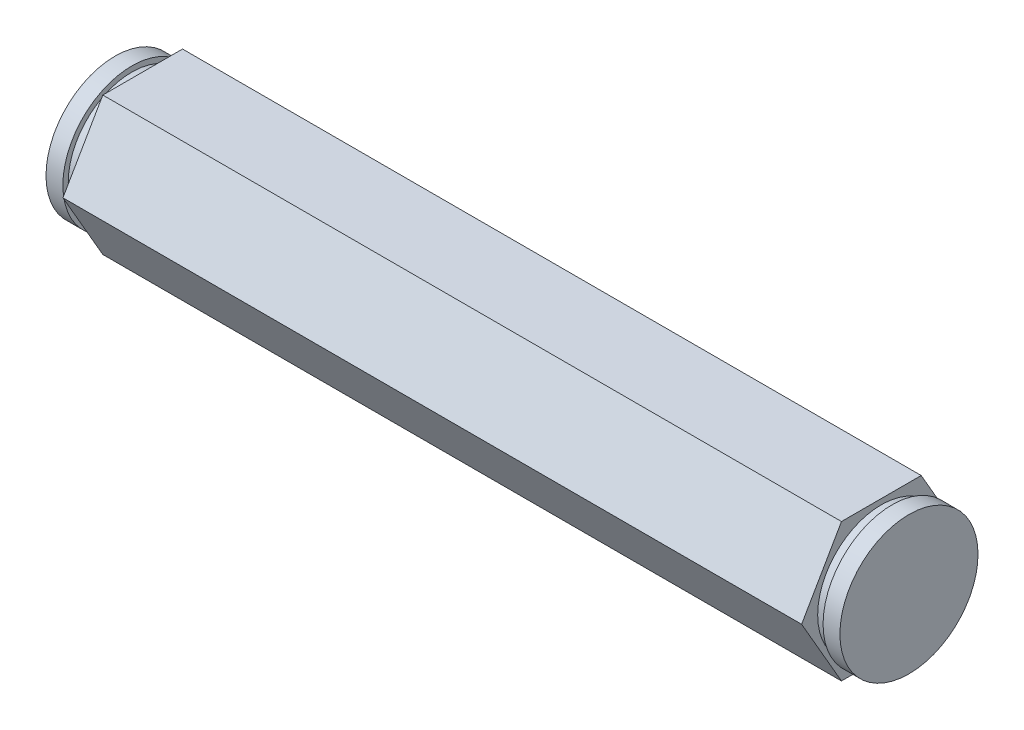
ISO-10303-21;
HEADER;
FILE_DESCRIPTION(('STEP AP214'),'2;1');
FILE_NAME('part.step','',(''),(''),'','','');
FILE_SCHEMA(('AUTOMOTIVE_DESIGN { 1 0 10303 214 1 1 1 1 }'));
ENDSEC;
DATA;
#1=APPLICATION_CONTEXT('core data for automotive mechanical design processes');
#2=APPLICATION_PROTOCOL_DEFINITION('international standard','automotive_design',2000,#1);
#3=PRODUCT_CONTEXT('',#1,'mechanical');
#4=PRODUCT('Part','Part','',(#3));
#5=PRODUCT_RELATED_PRODUCT_CATEGORY('part','',(#4));
#6=PRODUCT_DEFINITION_FORMATION('','',#4);
#7=PRODUCT_DEFINITION_CONTEXT('part definition',#1,'design');
#8=PRODUCT_DEFINITION('design','',#6,#7);
#9=PRODUCT_DEFINITION_SHAPE('','',#8);
#10=(LENGTH_UNIT() NAMED_UNIT(*) SI_UNIT(.MILLI.,.METRE.));
#11=(NAMED_UNIT(*) PLANE_ANGLE_UNIT() SI_UNIT($,.RADIAN.));
#12=(NAMED_UNIT(*) SI_UNIT($,.STERADIAN.) SOLID_ANGLE_UNIT());
#13=UNCERTAINTY_MEASURE_WITH_UNIT(LENGTH_MEASURE(1.E-05),#10,'distance_accuracy_value','');
#14=(GEOMETRIC_REPRESENTATION_CONTEXT(3) GLOBAL_UNCERTAINTY_ASSIGNED_CONTEXT((#13)) GLOBAL_UNIT_ASSIGNED_CONTEXT((#10,
#11,#12)) REPRESENTATION_CONTEXT('',''));
#15=CARTESIAN_POINT('',(0.,0.,0.));
#16=DIRECTION('',(0.,0.,1.));
#17=DIRECTION('',(1.,0.,0.));
#18=AXIS2_PLACEMENT_3D('',#15,#16,#17);
#19=CARTESIAN_POINT('',(36.50750001,-6.34999999999993,-3.66617420935418));
#20=DIRECTION('',(0.,0.499999999999995,0.866025403784441));
#21=DIRECTION('',(0.,-0.866025403784441,0.499999999999995));
#22=AXIS2_PLACEMENT_3D('',#19,#20,#21);
#23=PLANE('',#22);
#24=DIRECTION('',(-1.,0.,0.));
#25=VECTOR('',#24,1.);
#26=CARTESIAN_POINT('',(36.50750001,-6.34999999999993,-3.66617420935418));
#27=LINE('',#26,#25);
#28=CARTESIAN_POINT('',(33.96750001,-6.34999999999993,-3.66617420935418));
#29=VERTEX_POINT('',#28);
#30=CARTESIAN_POINT('',(-33.96750001,-6.34999999999993,-3.66617420935418));
#31=VERTEX_POINT('',#30);
#32=EDGE_CURVE('E114',#29,#31,#27,.T.);
#33=ORIENTED_EDGE('',*,*,#32,.T.);
#34=DIRECTION('',(0.,0.866025403784441,-0.499999999999995));
#35=VECTOR('',#34,1.);
#36=CARTESIAN_POINT('',(-33.96750001,-6.34999999999993,-3.66617420935418));
#37=LINE('',#36,#35);
#38=CARTESIAN_POINT('',(-33.96750001,0.,-7.33234841870821));
#39=VERTEX_POINT('',#38);
#40=EDGE_CURVE('E58',#31,#39,#37,.T.);
#41=ORIENTED_EDGE('',*,*,#40,.T.);
#42=DIRECTION('',(-1.,0.,0.));
#43=VECTOR('',#42,1.);
#44=CARTESIAN_POINT('',(36.50750001,0.,-7.33234841870821));
#45=LINE('',#44,#43);
#46=CARTESIAN_POINT('',(33.96750001,0.,-7.33234841870821));
#47=VERTEX_POINT('',#46);
#48=EDGE_CURVE('E131',#47,#39,#45,.T.);
#49=ORIENTED_EDGE('',*,*,#48,.F.);
#50=DIRECTION('',(0.,-0.866025403784441,0.499999999999995));
#51=VECTOR('',#50,1.);
#52=CARTESIAN_POINT('',(33.96750001,-6.34999999999993,-3.66617420935418));
#53=LINE('',#52,#51);
#54=EDGE_CURVE('E120',#47,#29,#53,.T.);
#55=ORIENTED_EDGE('',*,*,#54,.T.);
#56=EDGE_LOOP('',(#33,#41,#49,#55));
#57=FACE_BOUND('',#56,.T.);
#58=ADVANCED_FACE('F43',(#57),#23,.F.);
#59=CARTESIAN_POINT('',(36.50750001,0.,-7.33234841870821));
#60=DIRECTION('',(0.,-0.500000000000001,0.866025403784438));
#61=DIRECTION('',(0.,-0.866025403784438,-0.500000000000001));
#62=AXIS2_PLACEMENT_3D('',#59,#60,#61);
#63=PLANE('',#62);
#64=ORIENTED_EDGE('',*,*,#48,.T.);
#65=DIRECTION('',(0.,0.866025403784438,0.500000000000001));
#66=VECTOR('',#65,1.);
#67=CARTESIAN_POINT('',(-33.96750001,0.,-7.33234841870821));
#68=LINE('',#67,#66);
#69=CARTESIAN_POINT('',(-33.96750001,6.34999999999998,-3.66617420935409));
#70=VERTEX_POINT('',#69);
#71=EDGE_CURVE('E171',#39,#70,#68,.T.);
#72=ORIENTED_EDGE('',*,*,#71,.T.);
#73=DIRECTION('',(-1.,0.,0.));
#74=VECTOR('',#73,1.);
#75=CARTESIAN_POINT('',(36.50750001,6.34999999999998,-3.66617420935409));
#76=LINE('',#75,#74);
#77=CARTESIAN_POINT('',(33.96750001,6.34999999999998,-3.66617420935409));
#78=VERTEX_POINT('',#77);
#79=EDGE_CURVE('E127',#78,#70,#76,.T.);
#80=ORIENTED_EDGE('',*,*,#79,.F.);
#81=DIRECTION('',(0.,-0.866025403784438,-0.500000000000001));
#82=VECTOR('',#81,1.);
#83=CARTESIAN_POINT('',(33.96750001,0.,-7.33234841870821));
#84=LINE('',#83,#82);
#85=EDGE_CURVE('E199',#78,#47,#84,.T.);
#86=ORIENTED_EDGE('',*,*,#85,.T.);
#87=EDGE_LOOP('',(#64,#72,#80,#86));
#88=FACE_BOUND('',#87,.T.);
#89=ADVANCED_FACE('F209',(#88),#63,.F.);
#90=CARTESIAN_POINT('',(36.50750001,6.34999999999998,-3.66617420935409));
#91=DIRECTION('',(0.,-1.,0.));
#92=DIRECTION('',(0.,0.,-1.));
#93=AXIS2_PLACEMENT_3D('',#90,#91,#92);
#94=PLANE('',#93);
#95=ORIENTED_EDGE('',*,*,#79,.T.);
#96=DIRECTION('',(0.,0.,1.));
#97=VECTOR('',#96,1.);
#98=CARTESIAN_POINT('',(-33.96750001,6.34999999999998,-3.66617420935409));
#99=LINE('',#98,#97);
#100=CARTESIAN_POINT('',(-33.96750001,6.34999999999995,3.66617420935414));
#101=VERTEX_POINT('',#100);
#102=EDGE_CURVE('E167',#70,#101,#99,.T.);
#103=ORIENTED_EDGE('',*,*,#102,.T.);
#104=DIRECTION('',(-1.,0.,0.));
#105=VECTOR('',#104,1.);
#106=CARTESIAN_POINT('',(36.50750001,6.34999999999995,3.66617420935414));
#107=LINE('',#106,#105);
#108=CARTESIAN_POINT('',(33.96750001,6.34999999999995,3.66617420935414));
#109=VERTEX_POINT('',#108);
#110=EDGE_CURVE('E118',#109,#101,#107,.T.);
#111=ORIENTED_EDGE('',*,*,#110,.F.);
#112=DIRECTION('',(0.,0.,-1.));
#113=VECTOR('',#112,1.);
#114=CARTESIAN_POINT('',(33.96750001,6.34999999999998,-3.66617420935409));
#115=LINE('',#114,#113);
#116=EDGE_CURVE('E195',#109,#78,#115,.T.);
#117=ORIENTED_EDGE('',*,*,#116,.T.);
#118=EDGE_LOOP('',(#95,#103,#111,#117));
#119=FACE_BOUND('',#118,.T.);
#120=ADVANCED_FACE('F211',(#119),#94,.F.);
#121=CARTESIAN_POINT('',(36.50750001,6.34999999999995,3.66617420935414));
#122=DIRECTION('',(0.,-0.499999999999995,-0.866025403784442));
#123=DIRECTION('',(0.,0.866025403784442,-0.499999999999995));
#124=AXIS2_PLACEMENT_3D('',#121,#122,#123);
#125=PLANE('',#124);
#126=ORIENTED_EDGE('',*,*,#110,.T.);
#127=DIRECTION('',(0.,-0.866025403784442,0.499999999999995));
#128=VECTOR('',#127,1.);
#129=CARTESIAN_POINT('',(-33.96750001,6.34999999999995,3.66617420935414));
#130=LINE('',#129,#128);
#131=CARTESIAN_POINT('',(-33.96750001,0.,7.33234841870821));
#132=VERTEX_POINT('',#131);
#133=EDGE_CURVE('E108',#101,#132,#130,.T.);
#134=ORIENTED_EDGE('',*,*,#133,.T.);
#135=DIRECTION('',(-1.,0.,0.));
#136=VECTOR('',#135,1.);
#137=CARTESIAN_POINT('',(36.50750001,0.,7.33234841870821));
#138=LINE('',#137,#136);
#139=CARTESIAN_POINT('',(33.96750001,0.,7.33234841870821));
#140=VERTEX_POINT('',#139);
#141=EDGE_CURVE('E106',#140,#132,#138,.T.);
#142=ORIENTED_EDGE('',*,*,#141,.F.);
#143=DIRECTION('',(0.,0.866025403784442,-0.499999999999995));
#144=VECTOR('',#143,1.);
#145=CARTESIAN_POINT('',(33.96750001,6.34999999999995,3.66617420935414));
#146=LINE('',#145,#144);
#147=EDGE_CURVE('E191',#140,#109,#146,.T.);
#148=ORIENTED_EDGE('',*,*,#147,.T.);
#149=EDGE_LOOP('',(#126,#134,#142,#148));
#150=FACE_BOUND('',#149,.T.);
#151=ADVANCED_FACE('F214',(#150),#125,.F.);
#152=CARTESIAN_POINT('',(36.50750001,0.,7.33234841870821));
#153=DIRECTION('',(0.,0.500000000000007,-0.866025403784435));
#154=DIRECTION('',(0.,0.866025403784434,0.500000000000007));
#155=AXIS2_PLACEMENT_3D('',#152,#153,#154);
#156=PLANE('',#155);
#157=ORIENTED_EDGE('',*,*,#141,.T.);
#158=DIRECTION('',(0.,-0.866025403784434,-0.500000000000007));
#159=VECTOR('',#158,1.);
#160=CARTESIAN_POINT('',(-33.96750001,0.,7.33234841870821));
#161=LINE('',#160,#159);
#162=CARTESIAN_POINT('',(-33.96750001,-6.35,3.66617420935405));
#163=VERTEX_POINT('',#162);
#164=EDGE_CURVE('E94',#132,#163,#161,.T.);
#165=ORIENTED_EDGE('',*,*,#164,.T.);
#166=DIRECTION('',(-1.,0.,0.));
#167=VECTOR('',#166,1.);
#168=CARTESIAN_POINT('',(36.50750001,-6.35,3.66617420935405));
#169=LINE('',#168,#167);
#170=CARTESIAN_POINT('',(33.96750001,-6.35,3.66617420935405));
#171=VERTEX_POINT('',#170);
#172=EDGE_CURVE('E104',#171,#163,#169,.T.);
#173=ORIENTED_EDGE('',*,*,#172,.F.);
#174=DIRECTION('',(0.,0.866025403784434,0.500000000000007));
#175=VECTOR('',#174,1.);
#176=CARTESIAN_POINT('',(33.96750001,0.,7.33234841870821));
#177=LINE('',#176,#175);
#178=EDGE_CURVE('E65',#171,#140,#177,.T.);
#179=ORIENTED_EDGE('',*,*,#178,.T.);
#180=EDGE_LOOP('',(#157,#165,#173,#179));
#181=FACE_BOUND('',#180,.T.);
#182=ADVANCED_FACE('F103',(#181),#156,.F.);
#183=CARTESIAN_POINT('',(36.50750001,-6.35,3.66617420935405));
#184=DIRECTION('',(0.,1.,0.));
#185=DIRECTION('',(0.,0.,1.));
#186=AXIS2_PLACEMENT_3D('',#183,#184,#185);
#187=PLANE('',#186);
#188=ORIENTED_EDGE('',*,*,#172,.T.);
#189=DIRECTION('',(0.,0.,-1.));
#190=VECTOR('',#189,1.);
#191=CARTESIAN_POINT('',(-33.96750001,-6.35,3.66617420935405));
#192=LINE('',#191,#190);
#193=EDGE_CURVE('E11',#163,#31,#192,.T.);
#194=ORIENTED_EDGE('',*,*,#193,.T.);
#195=ORIENTED_EDGE('',*,*,#32,.F.);
#196=DIRECTION('',(0.,0.,1.));
#197=VECTOR('',#196,1.);
#198=CARTESIAN_POINT('',(33.96750001,-6.35,3.66617420935405));
#199=LINE('',#198,#197);
#200=EDGE_CURVE('E112',#29,#171,#199,.T.);
#201=ORIENTED_EDGE('',*,*,#200,.T.);
#202=EDGE_LOOP('',(#188,#194,#195,#201));
#203=FACE_BOUND('',#202,.T.);
#204=ADVANCED_FACE('F111',(#203),#187,.F.);
#205=CARTESIAN_POINT('',(33.96750001,0.,8.89));
#206=DIRECTION('',(-1.,0.,0.));
#207=DIRECTION('',(0.,0.,1.));
#208=AXIS2_PLACEMENT_3D('',#205,#206,#207);
#209=PLANE('',#208);
#210=CARTESIAN_POINT('',(33.96750001,0.,0.));
#211=DIRECTION('',(-1.,0.,0.));
#212=DIRECTION('',(0.,0.,1.));
#213=AXIS2_PLACEMENT_3D('',#210,#211,#212);
#214=CIRCLE('',#213,5.8547);
#215=CARTESIAN_POINT('',(33.96750001,0.,5.8547));
#216=VERTEX_POINT('',#215);
#217=EDGE_CURVE('E185',#216,#216,#214,.T.);
#218=ORIENTED_EDGE('',*,*,#217,.T.);
#219=EDGE_LOOP('',(#218));
#220=FACE_BOUND('',#219,.T.);
#221=ORIENTED_EDGE('',*,*,#85,.F.);
#222=ORIENTED_EDGE('',*,*,#116,.F.);
#223=ORIENTED_EDGE('',*,*,#147,.F.);
#224=ORIENTED_EDGE('',*,*,#178,.F.);
#225=ORIENTED_EDGE('',*,*,#200,.F.);
#226=ORIENTED_EDGE('',*,*,#54,.F.);
#227=EDGE_LOOP('',(#221,#222,#223,#224,#225,#226));
#228=FACE_BOUND('',#227,.T.);
#229=ADVANCED_FACE('F206',(#220,#228),#209,.F.);
#230=CARTESIAN_POINT('',(0.,0.,0.));
#231=DIRECTION('',(-1.,0.,0.));
#232=DIRECTION('',(0.,0.,1.));
#233=AXIS2_PLACEMENT_3D('',#230,#231,#232);
#234=CYLINDRICAL_SURFACE('',#233,6.35);
#235=CARTESIAN_POINT('',(36.50750001,0.,0.));
#236=DIRECTION('',(1.,0.,0.));
#237=DIRECTION('',(0.,0.,-1.));
#238=AXIS2_PLACEMENT_3D('',#235,#236,#237);
#239=CIRCLE('',#238,6.35);
#240=CARTESIAN_POINT('',(36.50750001,0.,-6.35));
#241=VERTEX_POINT('',#240);
#242=EDGE_CURVE('E135',#241,#241,#239,.F.);
#243=ORIENTED_EDGE('',*,*,#242,.T.);
#244=EDGE_LOOP('',(#243));
#245=FACE_BOUND('',#244,.T.);
#246=CARTESIAN_POINT('',(34.95810001,0.,0.));
#247=DIRECTION('',(-1.,0.,0.));
#248=DIRECTION('',(0.,0.,1.));
#249=AXIS2_PLACEMENT_3D('',#246,#247,#248);
#250=CIRCLE('',#249,6.35);
#251=CARTESIAN_POINT('',(34.95810001,0.,6.35));
#252=VERTEX_POINT('',#251);
#253=EDGE_CURVE('E177',#252,#252,#250,.T.);
#254=ORIENTED_EDGE('',*,*,#253,.F.);
#255=EDGE_LOOP('',(#254));
#256=FACE_BOUND('',#255,.T.);
#257=ADVANCED_FACE('F331',(#245,#256),#234,.T.);
#258=CARTESIAN_POINT('',(0.,0.,0.));
#259=DIRECTION('',(-1.,0.,0.));
#260=DIRECTION('',(0.,0.,1.));
#261=AXIS2_PLACEMENT_3D('',#258,#259,#260);
#262=CYLINDRICAL_SURFACE('',#261,5.8547);
#263=ORIENTED_EDGE('',*,*,#217,.F.);
#264=EDGE_LOOP('',(#263));
#265=FACE_BOUND('',#264,.T.);
#266=CARTESIAN_POINT('',(34.95810001,0.,0.));
#267=DIRECTION('',(-1.,0.,0.));
#268=DIRECTION('',(0.,0.,1.));
#269=AXIS2_PLACEMENT_3D('',#266,#267,#268);
#270=CIRCLE('',#269,5.8547);
#271=CARTESIAN_POINT('',(34.95810001,0.,5.8547));
#272=VERTEX_POINT('',#271);
#273=EDGE_CURVE('E181',#272,#272,#270,.T.);
#274=ORIENTED_EDGE('',*,*,#273,.T.);
#275=EDGE_LOOP('',(#274));
#276=FACE_BOUND('',#275,.T.);
#277=ADVANCED_FACE('F319',(#265,#276),#262,.T.);
#278=CARTESIAN_POINT('',(34.95810001,0.,5.8547));
#279=DIRECTION('',(1.,0.,0.));
#280=DIRECTION('',(0.,0.,-1.));
#281=AXIS2_PLACEMENT_3D('',#278,#279,#280);
#282=PLANE('',#281);
#283=ORIENTED_EDGE('',*,*,#273,.F.);
#284=EDGE_LOOP('',(#283));
#285=FACE_BOUND('',#284,.T.);
#286=ORIENTED_EDGE('',*,*,#253,.T.);
#287=EDGE_LOOP('',(#286));
#288=FACE_BOUND('',#287,.T.);
#289=ADVANCED_FACE('F313',(#285,#288),#282,.F.);
#290=CARTESIAN_POINT('',(36.50750001,0.,0.));
#291=DIRECTION('',(1.,0.,0.));
#292=DIRECTION('',(0.,0.,-1.));
#293=AXIS2_PLACEMENT_3D('',#290,#291,#292);
#294=PLANE('',#293);
#295=ORIENTED_EDGE('',*,*,#242,.F.);
#296=EDGE_LOOP('',(#295));
#297=FACE_BOUND('',#296,.T.);
#298=ADVANCED_FACE('F266',(#297),#294,.T.);
#299=CARTESIAN_POINT('',(-33.96750001,0.,8.89));
#300=DIRECTION('',(1.,0.,0.));
#301=DIRECTION('',(0.,0.,1.));
#302=AXIS2_PLACEMENT_3D('',#299,#300,#301);
#303=PLANE('',#302);
#304=CARTESIAN_POINT('',(-33.96750001,0.,0.));
#305=DIRECTION('',(-1.,0.,0.));
#306=DIRECTION('',(0.,0.,1.));
#307=AXIS2_PLACEMENT_3D('',#304,#305,#306);
#308=CIRCLE('',#307,5.8547);
#309=CARTESIAN_POINT('',(-33.96750001,0.,5.8547));
#310=VERTEX_POINT('',#309);
#311=EDGE_CURVE('E109',#310,#310,#308,.T.);
#312=ORIENTED_EDGE('',*,*,#311,.F.);
#313=EDGE_LOOP('',(#312));
#314=FACE_BOUND('',#313,.T.);
#315=ORIENTED_EDGE('',*,*,#193,.F.);
#316=ORIENTED_EDGE('',*,*,#164,.F.);
#317=ORIENTED_EDGE('',*,*,#133,.F.);
#318=ORIENTED_EDGE('',*,*,#102,.F.);
#319=ORIENTED_EDGE('',*,*,#71,.F.);
#320=ORIENTED_EDGE('',*,*,#40,.F.);
#321=EDGE_LOOP('',(#315,#316,#317,#318,#319,#320));
#322=FACE_BOUND('',#321,.T.);
#323=ADVANCED_FACE('F93',(#314,#322),#303,.F.);
#324=CARTESIAN_POINT('',(0.,0.,0.));
#325=DIRECTION('',(1.,0.,0.));
#326=DIRECTION('',(0.,0.,1.));
#327=AXIS2_PLACEMENT_3D('',#324,#325,#326);
#328=CYLINDRICAL_SURFACE('',#327,6.35);
#329=CARTESIAN_POINT('',(-36.50750001,0.,0.));
#330=DIRECTION('',(1.,0.,0.));
#331=DIRECTION('',(0.,0.,-1.));
#332=AXIS2_PLACEMENT_3D('',#329,#330,#331);
#333=CIRCLE('',#332,6.35);
#334=CARTESIAN_POINT('',(-36.50750001,0.,-6.35));
#335=VERTEX_POINT('',#334);
#336=EDGE_CURVE('E51',#335,#335,#333,.F.);
#337=ORIENTED_EDGE('',*,*,#336,.F.);
#338=EDGE_LOOP('',(#337));
#339=FACE_BOUND('',#338,.T.);
#340=CARTESIAN_POINT('',(-34.95810001,0.,0.));
#341=DIRECTION('',(-1.,0.,0.));
#342=DIRECTION('',(0.,0.,1.));
#343=AXIS2_PLACEMENT_3D('',#340,#341,#342);
#344=CIRCLE('',#343,6.35);
#345=CARTESIAN_POINT('',(-34.95810001,0.,6.35));
#346=VERTEX_POINT('',#345);
#347=EDGE_CURVE('E153',#346,#346,#344,.T.);
#348=ORIENTED_EDGE('',*,*,#347,.T.);
#349=EDGE_LOOP('',(#348));
#350=FACE_BOUND('',#349,.T.);
#351=ADVANCED_FACE('F146',(#339,#350),#328,.T.);
#352=CARTESIAN_POINT('',(0.,0.,0.));
#353=DIRECTION('',(1.,0.,0.));
#354=DIRECTION('',(0.,0.,1.));
#355=AXIS2_PLACEMENT_3D('',#352,#353,#354);
#356=CYLINDRICAL_SURFACE('',#355,5.8547);
#357=ORIENTED_EDGE('',*,*,#311,.T.);
#358=EDGE_LOOP('',(#357));
#359=FACE_BOUND('',#358,.T.);
#360=CARTESIAN_POINT('',(-34.95810001,0.,0.));
#361=DIRECTION('',(-1.,0.,0.));
#362=DIRECTION('',(0.,0.,1.));
#363=AXIS2_PLACEMENT_3D('',#360,#361,#362);
#364=CIRCLE('',#363,5.8547);
#365=CARTESIAN_POINT('',(-34.95810001,0.,5.8547));
#366=VERTEX_POINT('',#365);
#367=EDGE_CURVE('E156',#366,#366,#364,.T.);
#368=ORIENTED_EDGE('',*,*,#367,.F.);
#369=EDGE_LOOP('',(#368));
#370=FACE_BOUND('',#369,.T.);
#371=ADVANCED_FACE('F149',(#359,#370),#356,.T.);
#372=CARTESIAN_POINT('',(-34.95810001,0.,5.8547));
#373=DIRECTION('',(-1.,0.,0.));
#374=DIRECTION('',(0.,0.,-1.));
#375=AXIS2_PLACEMENT_3D('',#372,#373,#374);
#376=PLANE('',#375);
#377=ORIENTED_EDGE('',*,*,#367,.T.);
#378=EDGE_LOOP('',(#377));
#379=FACE_BOUND('',#378,.T.);
#380=ORIENTED_EDGE('',*,*,#347,.F.);
#381=EDGE_LOOP('',(#380));
#382=FACE_BOUND('',#381,.T.);
#383=ADVANCED_FACE('F286',(#379,#382),#376,.F.);
#384=CARTESIAN_POINT('',(-36.50750001,0.,0.));
#385=DIRECTION('',(1.,0.,0.));
#386=DIRECTION('',(0.,0.,-1.));
#387=AXIS2_PLACEMENT_3D('',#384,#385,#386);
#388=PLANE('',#387);
#389=ORIENTED_EDGE('',*,*,#336,.T.);
#390=EDGE_LOOP('',(#389));
#391=FACE_BOUND('',#390,.T.);
#392=ADVANCED_FACE('F144',(#391),#388,.F.);
#393=CLOSED_SHELL('',(#58,#89,#120,#151,#182,#204,#229,#257,#277,#289,#298,#323,#351,#371,#383,#392));
#394=MANIFOLD_SOLID_BREP('B2',#393);
#395=ADVANCED_BREP_SHAPE_REPRESENTATION('',(#18,#394),#14);
#396=SHAPE_DEFINITION_REPRESENTATION(#9,#395);
ENDSEC;
END-ISO-10303-21;
